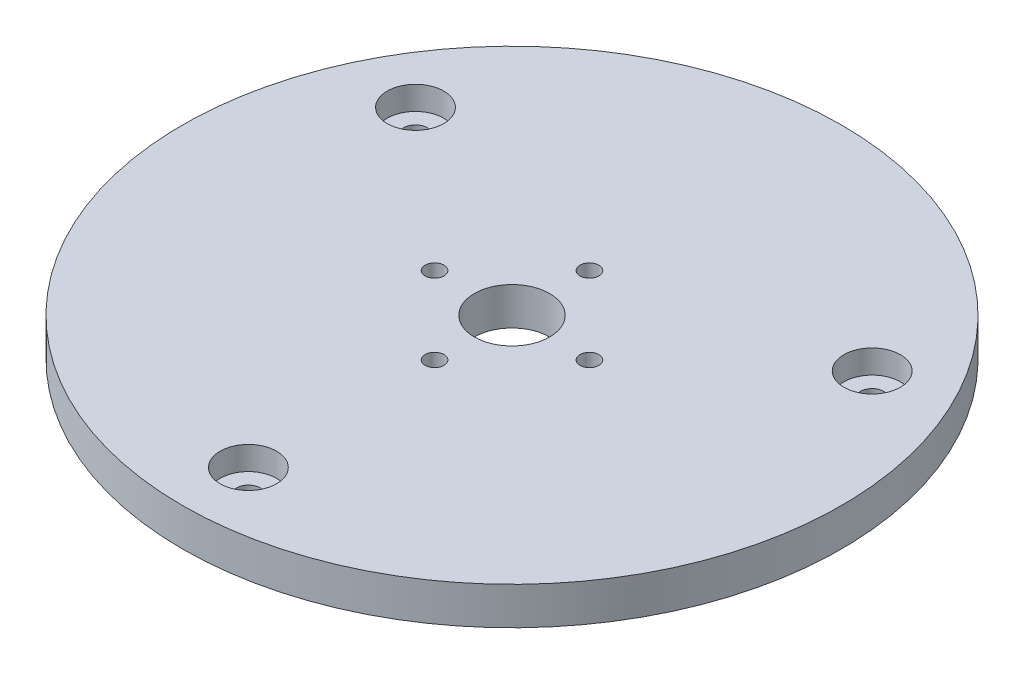
ISO-10303-21;
HEADER;
FILE_DESCRIPTION(('STEP AP214'),'2;1');
FILE_NAME('part.step','',(''),(''),'','','');
FILE_SCHEMA(('AUTOMOTIVE_DESIGN { 1 0 10303 214 1 1 1 1 }'));
ENDSEC;
DATA;
#1=APPLICATION_CONTEXT('core data for automotive mechanical design processes');
#2=APPLICATION_PROTOCOL_DEFINITION('international standard','automotive_design',2000,#1);
#3=PRODUCT_CONTEXT('',#1,'mechanical');
#4=PRODUCT('Part','Part','',(#3));
#5=PRODUCT_RELATED_PRODUCT_CATEGORY('part','',(#4));
#6=PRODUCT_DEFINITION_FORMATION('','',#4);
#7=PRODUCT_DEFINITION_CONTEXT('part definition',#1,'design');
#8=PRODUCT_DEFINITION('design','',#6,#7);
#9=PRODUCT_DEFINITION_SHAPE('','',#8);
#10=(LENGTH_UNIT() NAMED_UNIT(*) SI_UNIT(.MILLI.,.METRE.));
#11=(NAMED_UNIT(*) PLANE_ANGLE_UNIT() SI_UNIT($,.RADIAN.));
#12=(NAMED_UNIT(*) SI_UNIT($,.STERADIAN.) SOLID_ANGLE_UNIT());
#13=UNCERTAINTY_MEASURE_WITH_UNIT(LENGTH_MEASURE(1.E-05),#10,'distance_accuracy_value','');
#14=(GEOMETRIC_REPRESENTATION_CONTEXT(3) GLOBAL_UNCERTAINTY_ASSIGNED_CONTEXT((#13)) GLOBAL_UNIT_ASSIGNED_CONTEXT((#10,
#11,#12)) REPRESENTATION_CONTEXT('',''));
#15=CARTESIAN_POINT('',(0.,0.,0.));
#16=DIRECTION('',(0.,0.,1.));
#17=DIRECTION('',(1.,0.,0.));
#18=AXIS2_PLACEMENT_3D('',#15,#16,#17);
#19=CARTESIAN_POINT('',(0.,0.,-8.2270625170551));
#20=DIRECTION('',(0.,1.,0.));
#21=DIRECTION('',(0.,0.,1.));
#22=AXIS2_PLACEMENT_3D('',#19,#20,#21);
#23=CYLINDRICAL_SURFACE('',#22,1.);
#24=CARTESIAN_POINT('',(0.,4.,-8.2270625170551));
#25=DIRECTION('',(0.,1.,0.));
#26=DIRECTION('',(0.,0.,1.));
#27=AXIS2_PLACEMENT_3D('',#24,#25,#26);
#28=CIRCLE('',#27,1.);
#29=CARTESIAN_POINT('',(0.,4.,-7.2270625170551));
#30=VERTEX_POINT('',#29);
#31=EDGE_CURVE('E52',#30,#30,#28,.T.);
#32=ORIENTED_EDGE('',*,*,#31,.T.);
#33=EDGE_LOOP('',(#32));
#34=FACE_BOUND('',#33,.T.);
#35=CARTESIAN_POINT('',(0.,2.5,-8.2270625170551));
#36=DIRECTION('',(0.,-1.,0.));
#37=DIRECTION('',(0.,0.,-1.));
#38=AXIS2_PLACEMENT_3D('',#35,#36,#37);
#39=CIRCLE('',#38,1.);
#40=CARTESIAN_POINT('',(0.,2.5,-9.2270625170551));
#41=VERTEX_POINT('',#40);
#42=EDGE_CURVE('E41',#41,#41,#39,.F.);
#43=ORIENTED_EDGE('',*,*,#42,.F.);
#44=EDGE_LOOP('',(#43));
#45=FACE_BOUND('',#44,.T.);
#46=ADVANCED_FACE('F37',(#34,#45),#23,.F.);
#47=CARTESIAN_POINT('',(-8.22706251705486,0.,2.33323418036613E-13));
#48=DIRECTION('',(0.,1.,0.));
#49=DIRECTION('',(0.,0.,1.));
#50=AXIS2_PLACEMENT_3D('',#47,#48,#49);
#51=CYLINDRICAL_SURFACE('',#50,1.00000000000037);
#52=CARTESIAN_POINT('',(-8.22706251705486,4.,2.33323418036613E-13));
#53=DIRECTION('',(0.,1.,0.));
#54=DIRECTION('',(0.,0.,1.));
#55=AXIS2_PLACEMENT_3D('',#52,#53,#54);
#56=CIRCLE('',#55,1.00000000000037);
#57=CARTESIAN_POINT('',(-8.22706251705486,4.,1.00000000000061));
#58=VERTEX_POINT('',#57);
#59=EDGE_CURVE('E114',#58,#58,#56,.T.);
#60=ORIENTED_EDGE('',*,*,#59,.T.);
#61=EDGE_LOOP('',(#60));
#62=FACE_BOUND('',#61,.T.);
#63=CARTESIAN_POINT('',(-8.22706251705486,2.5,2.33323418036613E-13));
#64=DIRECTION('',(0.,-1.,0.));
#65=DIRECTION('',(0.,0.,-1.));
#66=AXIS2_PLACEMENT_3D('',#63,#64,#65);
#67=CIRCLE('',#66,1.00000000000037);
#68=CARTESIAN_POINT('',(-8.22706251705486,2.5,-1.00000000000014));
#69=VERTEX_POINT('',#68);
#70=EDGE_CURVE('E79',#69,#69,#67,.F.);
#71=ORIENTED_EDGE('',*,*,#70,.F.);
#72=EDGE_LOOP('',(#71));
#73=FACE_BOUND('',#72,.T.);
#74=ADVANCED_FACE('F160',(#62,#73),#51,.F.);
#75=CARTESIAN_POINT('',(4.64631786917647E-13,0.,8.2270625170551));
#76=DIRECTION('',(0.,1.,0.));
#77=DIRECTION('',(0.,0.,1.));
#78=AXIS2_PLACEMENT_3D('',#75,#76,#77);
#79=CYLINDRICAL_SURFACE('',#78,1.0000000000005);
#80=CARTESIAN_POINT('',(4.64631786917647E-13,4.,8.2270625170551));
#81=DIRECTION('',(0.,1.,0.));
#82=DIRECTION('',(0.,0.,1.));
#83=AXIS2_PLACEMENT_3D('',#80,#81,#82);
#84=CIRCLE('',#83,1.0000000000005);
#85=CARTESIAN_POINT('',(4.64631786917647E-13,4.,9.22706251705559));
#86=VERTEX_POINT('',#85);
#87=EDGE_CURVE('E109',#86,#86,#84,.T.);
#88=ORIENTED_EDGE('',*,*,#87,.T.);
#89=EDGE_LOOP('',(#88));
#90=FACE_BOUND('',#89,.T.);
#91=CARTESIAN_POINT('',(4.64631786917647E-13,2.5,8.2270625170551));
#92=DIRECTION('',(0.,-1.,0.));
#93=DIRECTION('',(0.,0.,-1.));
#94=AXIS2_PLACEMENT_3D('',#91,#92,#93);
#95=CIRCLE('',#94,1.0000000000005);
#96=CARTESIAN_POINT('',(4.64631786917647E-13,2.5,7.2270625170546));
#97=VERTEX_POINT('',#96);
#98=EDGE_CURVE('E75',#97,#97,#95,.F.);
#99=ORIENTED_EDGE('',*,*,#98,.F.);
#100=EDGE_LOOP('',(#99));
#101=FACE_BOUND('',#100,.T.);
#102=ADVANCED_FACE('F166',(#90,#101),#79,.F.);
#103=CARTESIAN_POINT('',(8.22706251705533,0.,-2.32315893458824E-13));
#104=DIRECTION('',(0.,1.,0.));
#105=DIRECTION('',(0.,0.,1.));
#106=AXIS2_PLACEMENT_3D('',#103,#104,#105);
#107=CYLINDRICAL_SURFACE('',#106,1.00000000000018);
#108=CARTESIAN_POINT('',(8.22706251705533,4.,-2.32315893458824E-13));
#109=DIRECTION('',(0.,1.,0.));
#110=DIRECTION('',(0.,0.,1.));
#111=AXIS2_PLACEMENT_3D('',#108,#109,#110);
#112=CIRCLE('',#111,1.00000000000018);
#113=CARTESIAN_POINT('',(8.22706251705533,4.,0.99999999999995));
#114=VERTEX_POINT('',#113);
#115=EDGE_CURVE('E113',#114,#114,#112,.T.);
#116=ORIENTED_EDGE('',*,*,#115,.T.);
#117=EDGE_LOOP('',(#116));
#118=FACE_BOUND('',#117,.T.);
#119=CARTESIAN_POINT('',(8.22706251705533,2.5,-2.32315893458824E-13));
#120=DIRECTION('',(0.,-1.,0.));
#121=DIRECTION('',(0.,0.,-1.));
#122=AXIS2_PLACEMENT_3D('',#119,#120,#121);
#123=CIRCLE('',#122,1.00000000000018);
#124=CARTESIAN_POINT('',(8.22706251705533,2.5,-1.00000000000041));
#125=VERTEX_POINT('',#124);
#126=EDGE_CURVE('E71',#125,#125,#123,.F.);
#127=ORIENTED_EDGE('',*,*,#126,.F.);
#128=EDGE_LOOP('',(#127));
#129=FACE_BOUND('',#128,.T.);
#130=ADVANCED_FACE('F238',(#118,#129),#107,.F.);
#131=CARTESIAN_POINT('',(0.,0.,28.));
#132=DIRECTION('',(0.,1.,0.));
#133=DIRECTION('',(0.,0.,1.));
#134=AXIS2_PLACEMENT_3D('',#131,#132,#133);
#135=CYLINDRICAL_SURFACE('',#134,1.25);
#136=CARTESIAN_POINT('',(0.,0.,28.));
#137=DIRECTION('',(0.,1.,0.));
#138=DIRECTION('',(0.,0.,-1.));
#139=AXIS2_PLACEMENT_3D('',#136,#137,#138);
#140=CIRCLE('',#139,1.25);
#141=CARTESIAN_POINT('',(0.,0.,26.75));
#142=VERTEX_POINT('',#141);
#143=EDGE_CURVE('E119',#142,#142,#140,.T.);
#144=ORIENTED_EDGE('',*,*,#143,.F.);
#145=EDGE_LOOP('',(#144));
#146=FACE_BOUND('',#145,.T.);
#147=CARTESIAN_POINT('',(0.,1.5,28.));
#148=DIRECTION('',(0.,1.,0.));
#149=DIRECTION('',(0.,0.,1.));
#150=AXIS2_PLACEMENT_3D('',#147,#148,#149);
#151=CIRCLE('',#150,1.25);
#152=CARTESIAN_POINT('',(0.,1.5,29.25));
#153=VERTEX_POINT('',#152);
#154=EDGE_CURVE('E66',#153,#153,#151,.F.);
#155=ORIENTED_EDGE('',*,*,#154,.F.);
#156=EDGE_LOOP('',(#155));
#157=FACE_BOUND('',#156,.T.);
#158=ADVANCED_FACE('F341',(#146,#157),#135,.F.);
#159=CARTESIAN_POINT('',(-24.2487113059642,0.,-14.0000000000001));
#160=DIRECTION('',(0.,1.,0.));
#161=DIRECTION('',(0.,0.,1.));
#162=AXIS2_PLACEMENT_3D('',#159,#160,#161);
#163=CYLINDRICAL_SURFACE('',#162,1.25);
#164=CARTESIAN_POINT('',(-24.2487113059642,0.,-14.0000000000001));
#165=DIRECTION('',(0.,1.,0.));
#166=DIRECTION('',(0.,0.,-1.));
#167=AXIS2_PLACEMENT_3D('',#164,#165,#166);
#168=CIRCLE('',#167,1.25);
#169=CARTESIAN_POINT('',(-24.2487113059642,0.,-15.2500000000001));
#170=VERTEX_POINT('',#169);
#171=EDGE_CURVE('E118',#170,#170,#168,.T.);
#172=ORIENTED_EDGE('',*,*,#171,.F.);
#173=EDGE_LOOP('',(#172));
#174=FACE_BOUND('',#173,.T.);
#175=CARTESIAN_POINT('',(-24.2487113059642,1.5,-14.0000000000001));
#176=DIRECTION('',(0.,1.,0.));
#177=DIRECTION('',(0.,0.,1.));
#178=AXIS2_PLACEMENT_3D('',#175,#176,#177);
#179=CIRCLE('',#178,1.25);
#180=CARTESIAN_POINT('',(-24.2487113059642,1.5,-12.7500000000001));
#181=VERTEX_POINT('',#180);
#182=EDGE_CURVE('E61',#181,#181,#179,.F.);
#183=ORIENTED_EDGE('',*,*,#182,.F.);
#184=EDGE_LOOP('',(#183));
#185=FACE_BOUND('',#184,.T.);
#186=ADVANCED_FACE('F138',(#174,#185),#163,.F.);
#187=CARTESIAN_POINT('',(24.2487113059644,0.,-13.9999999999998));
#188=DIRECTION('',(0.,1.,0.));
#189=DIRECTION('',(0.,0.,1.));
#190=AXIS2_PLACEMENT_3D('',#187,#188,#189);
#191=CYLINDRICAL_SURFACE('',#190,1.25);
#192=CARTESIAN_POINT('',(24.2487113059644,0.,-13.9999999999998));
#193=DIRECTION('',(0.,1.,0.));
#194=DIRECTION('',(0.,0.,-1.));
#195=AXIS2_PLACEMENT_3D('',#192,#193,#194);
#196=CIRCLE('',#195,1.25);
#197=CARTESIAN_POINT('',(24.2487113059644,0.,-15.2499999999998));
#198=VERTEX_POINT('',#197);
#199=EDGE_CURVE('E105',#198,#198,#196,.T.);
#200=ORIENTED_EDGE('',*,*,#199,.F.);
#201=EDGE_LOOP('',(#200));
#202=FACE_BOUND('',#201,.T.);
#203=CARTESIAN_POINT('',(24.2487113059644,1.5,-13.9999999999998));
#204=DIRECTION('',(0.,1.,0.));
#205=DIRECTION('',(0.,0.,1.));
#206=AXIS2_PLACEMENT_3D('',#203,#204,#205);
#207=CIRCLE('',#206,1.25);
#208=CARTESIAN_POINT('',(24.2487113059644,1.5,-12.7499999999998));
#209=VERTEX_POINT('',#208);
#210=EDGE_CURVE('E57',#209,#209,#207,.F.);
#211=ORIENTED_EDGE('',*,*,#210,.F.);
#212=EDGE_LOOP('',(#211));
#213=FACE_BOUND('',#212,.T.);
#214=ADVANCED_FACE('F135',(#202,#213),#191,.F.);
#215=CARTESIAN_POINT('',(0.,4.,0.));
#216=DIRECTION('',(0.,-1.,0.));
#217=DIRECTION('',(0.,0.,-1.));
#218=AXIS2_PLACEMENT_3D('',#215,#216,#217);
#219=CYLINDRICAL_SURFACE('',#218,35.);
#220=CARTESIAN_POINT('',(0.,4.,0.));
#221=DIRECTION('',(0.,1.,0.));
#222=DIRECTION('',(0.,0.,1.));
#223=AXIS2_PLACEMENT_3D('',#220,#221,#222);
#224=CIRCLE('',#223,35.);
#225=CARTESIAN_POINT('',(0.,4.,35.));
#226=VERTEX_POINT('',#225);
#227=EDGE_CURVE('E10',#226,#226,#224,.T.);
#228=ORIENTED_EDGE('',*,*,#227,.F.);
#229=EDGE_LOOP('',(#228));
#230=FACE_BOUND('',#229,.T.);
#231=CARTESIAN_POINT('',(0.,0.,0.));
#232=DIRECTION('',(0.,1.,0.));
#233=DIRECTION('',(0.,0.,1.));
#234=AXIS2_PLACEMENT_3D('',#231,#232,#233);
#235=CIRCLE('',#234,35.);
#236=CARTESIAN_POINT('',(0.,0.,35.));
#237=VERTEX_POINT('',#236);
#238=EDGE_CURVE('E46',#237,#237,#235,.T.);
#239=ORIENTED_EDGE('',*,*,#238,.T.);
#240=EDGE_LOOP('',(#239));
#241=FACE_BOUND('',#240,.T.);
#242=ADVANCED_FACE('F39',(#230,#241),#219,.T.);
#243=CARTESIAN_POINT('',(0.,4.,0.));
#244=DIRECTION('',(0.,1.,0.));
#245=DIRECTION('',(0.,0.,1.));
#246=AXIS2_PLACEMENT_3D('',#243,#244,#245);
#247=PLANE('',#246);
#248=CARTESIAN_POINT('',(24.2487113059644,4.,-13.9999999999998));
#249=DIRECTION('',(0.,1.,0.));
#250=DIRECTION('',(0.,0.,1.));
#251=AXIS2_PLACEMENT_3D('',#248,#249,#250);
#252=CIRCLE('',#251,3.);
#253=CARTESIAN_POINT('',(24.2487113059644,4.,-10.9999999999998));
#254=VERTEX_POINT('',#253);
#255=EDGE_CURVE('E209',#254,#254,#252,.T.);
#256=ORIENTED_EDGE('',*,*,#255,.F.);
#257=EDGE_LOOP('',(#256));
#258=FACE_BOUND('',#257,.T.);
#259=CARTESIAN_POINT('',(1.50620894495059E-12,4.,28.000000000001));
#260=DIRECTION('',(0.,1.,0.));
#261=DIRECTION('',(0.,0.,1.));
#262=AXIS2_PLACEMENT_3D('',#259,#260,#261);
#263=CIRCLE('',#262,2.99999999999943);
#264=CARTESIAN_POINT('',(1.50620894495059E-12,4.,31.0000000000005));
#265=VERTEX_POINT('',#264);
#266=EDGE_CURVE('E97',#265,#265,#263,.T.);
#267=ORIENTED_EDGE('',*,*,#266,.F.);
#268=EDGE_LOOP('',(#267));
#269=FACE_BOUND('',#268,.T.);
#270=CARTESIAN_POINT('',(-24.2487113059642,4.,-13.9999999999982));
#271=DIRECTION('',(0.,1.,0.));
#272=DIRECTION('',(0.,0.,1.));
#273=AXIS2_PLACEMENT_3D('',#270,#271,#272);
#274=CIRCLE('',#273,3.00000000000145);
#275=CARTESIAN_POINT('',(-24.2487113059642,4.,-10.9999999999967));
#276=VERTEX_POINT('',#275);
#277=EDGE_CURVE('E86',#276,#276,#274,.T.);
#278=ORIENTED_EDGE('',*,*,#277,.F.);
#279=EDGE_LOOP('',(#278));
#280=FACE_BOUND('',#279,.T.);
#281=CARTESIAN_POINT('',(0.,4.,0.));
#282=DIRECTION('',(0.,1.,0.));
#283=DIRECTION('',(0.,0.,1.));
#284=AXIS2_PLACEMENT_3D('',#281,#282,#283);
#285=CIRCLE('',#284,4.);
#286=CARTESIAN_POINT('',(0.,4.,4.));
#287=VERTEX_POINT('',#286);
#288=EDGE_CURVE('E70',#287,#287,#285,.F.);
#289=ORIENTED_EDGE('',*,*,#288,.T.);
#290=EDGE_LOOP('',(#289));
#291=FACE_BOUND('',#290,.T.);
#292=ORIENTED_EDGE('',*,*,#115,.F.);
#293=EDGE_LOOP('',(#292));
#294=FACE_BOUND('',#293,.T.);
#295=ORIENTED_EDGE('',*,*,#87,.F.);
#296=EDGE_LOOP('',(#295));
#297=FACE_BOUND('',#296,.T.);
#298=ORIENTED_EDGE('',*,*,#59,.F.);
#299=EDGE_LOOP('',(#298));
#300=FACE_BOUND('',#299,.T.);
#301=ORIENTED_EDGE('',*,*,#31,.F.);
#302=EDGE_LOOP('',(#301));
#303=FACE_BOUND('',#302,.T.);
#304=ORIENTED_EDGE('',*,*,#227,.T.);
#305=EDGE_LOOP('',(#304));
#306=FACE_BOUND('',#305,.T.);
#307=ADVANCED_FACE('F173',(#258,#269,#280,#291,#294,#297,#300,#303,#306),#247,.T.);
#308=CARTESIAN_POINT('',(0.,0.,0.));
#309=DIRECTION('',(0.,1.,0.));
#310=DIRECTION('',(0.,0.,1.));
#311=AXIS2_PLACEMENT_3D('',#308,#309,#310);
#312=PLANE('',#311);
#313=CARTESIAN_POINT('',(4.64631786917647E-13,0.,8.2270625170551));
#314=DIRECTION('',(0.,-1.,0.));
#315=DIRECTION('',(0.,0.,-1.));
#316=AXIS2_PLACEMENT_3D('',#313,#314,#315);
#317=CIRCLE('',#316,2.);
#318=CARTESIAN_POINT('',(4.64631786917647E-13,0.,6.2270625170551));
#319=VERTEX_POINT('',#318);
#320=EDGE_CURVE('E183',#319,#319,#317,.T.);
#321=ORIENTED_EDGE('',*,*,#320,.F.);
#322=EDGE_LOOP('',(#321));
#323=FACE_BOUND('',#322,.T.);
#324=CARTESIAN_POINT('',(8.22706251705533,0.,-2.35338467192193E-13));
#325=DIRECTION('',(0.,-1.,0.));
#326=DIRECTION('',(0.,0.,-1.));
#327=AXIS2_PLACEMENT_3D('',#324,#325,#326);
#328=CIRCLE('',#327,2.00000000000018);
#329=CARTESIAN_POINT('',(8.22706251705533,0.,-2.00000000000041));
#330=VERTEX_POINT('',#329);
#331=EDGE_CURVE('E187',#330,#330,#328,.T.);
#332=ORIENTED_EDGE('',*,*,#331,.F.);
#333=EDGE_LOOP('',(#332));
#334=FACE_BOUND('',#333,.T.);
#335=CARTESIAN_POINT('',(0.,0.,-8.2270625170551));
#336=DIRECTION('',(0.,-1.,0.));
#337=DIRECTION('',(0.,0.,-1.));
#338=AXIS2_PLACEMENT_3D('',#335,#336,#337);
#339=CIRCLE('',#338,2.00000000000049);
#340=CARTESIAN_POINT('',(0.,0.,-10.2270625170556));
#341=VERTEX_POINT('',#340);
#342=EDGE_CURVE('E191',#341,#341,#339,.T.);
#343=ORIENTED_EDGE('',*,*,#342,.F.);
#344=EDGE_LOOP('',(#343));
#345=FACE_BOUND('',#344,.T.);
#346=CARTESIAN_POINT('',(-8.22706251705487,0.,2.34330942614403E-13));
#347=DIRECTION('',(0.,-1.,0.));
#348=DIRECTION('',(0.,0.,-1.));
#349=AXIS2_PLACEMENT_3D('',#346,#347,#348);
#350=CIRCLE('',#349,2.00000000000037);
#351=CARTESIAN_POINT('',(-8.22706251705487,0.,-2.00000000000014));
#352=VERTEX_POINT('',#351);
#353=EDGE_CURVE('E195',#352,#352,#350,.T.);
#354=ORIENTED_EDGE('',*,*,#353,.F.);
#355=EDGE_LOOP('',(#354));
#356=FACE_BOUND('',#355,.T.);
#357=CARTESIAN_POINT('',(0.,0.,0.));
#358=DIRECTION('',(0.,-1.,0.));
#359=DIRECTION('',(0.,0.,-1.));
#360=AXIS2_PLACEMENT_3D('',#357,#358,#359);
#361=CIRCLE('',#360,4.);
#362=CARTESIAN_POINT('',(0.,0.,-4.));
#363=VERTEX_POINT('',#362);
#364=EDGE_CURVE('E101',#363,#363,#361,.T.);
#365=ORIENTED_EDGE('',*,*,#364,.F.);
#366=EDGE_LOOP('',(#365));
#367=FACE_BOUND('',#366,.T.);
#368=ORIENTED_EDGE('',*,*,#199,.T.);
#369=EDGE_LOOP('',(#368));
#370=FACE_BOUND('',#369,.T.);
#371=ORIENTED_EDGE('',*,*,#171,.T.);
#372=EDGE_LOOP('',(#371));
#373=FACE_BOUND('',#372,.T.);
#374=ORIENTED_EDGE('',*,*,#143,.T.);
#375=EDGE_LOOP('',(#374));
#376=FACE_BOUND('',#375,.T.);
#377=ORIENTED_EDGE('',*,*,#238,.F.);
#378=EDGE_LOOP('',(#377));
#379=FACE_BOUND('',#378,.T.);
#380=ADVANCED_FACE('F132',(#323,#334,#345,#356,#367,#370,#373,#376,#379),#312,.F.);
#381=CARTESIAN_POINT('',(0.,4.001,0.));
#382=DIRECTION('',(0.,-1.,0.));
#383=DIRECTION('',(0.,0.,-1.));
#384=AXIS2_PLACEMENT_3D('',#381,#382,#383);
#385=CYLINDRICAL_SURFACE('',#384,4.);
#386=ORIENTED_EDGE('',*,*,#288,.F.);
#387=EDGE_LOOP('',(#386));
#388=FACE_BOUND('',#387,.T.);
#389=ORIENTED_EDGE('',*,*,#364,.T.);
#390=EDGE_LOOP('',(#389));
#391=FACE_BOUND('',#390,.T.);
#392=ADVANCED_FACE('F145',(#388,#391),#385,.F.);
#393=CARTESIAN_POINT('',(24.2487113059644,1.5,-13.9999999999998));
#394=DIRECTION('',(0.,1.,0.));
#395=DIRECTION('',(0.,0.,1.));
#396=AXIS2_PLACEMENT_3D('',#393,#394,#395);
#397=PLANE('',#396);
#398=CARTESIAN_POINT('',(24.2487113059644,1.5,-13.9999999999998));
#399=DIRECTION('',(0.,1.,0.));
#400=DIRECTION('',(0.,0.,1.));
#401=AXIS2_PLACEMENT_3D('',#398,#399,#400);
#402=CIRCLE('',#401,3.);
#403=CARTESIAN_POINT('',(24.2487113059644,1.5,-10.9999999999998));
#404=VERTEX_POINT('',#403);
#405=EDGE_CURVE('E62',#404,#404,#402,.T.);
#406=ORIENTED_EDGE('',*,*,#405,.T.);
#407=EDGE_LOOP('',(#406));
#408=FACE_BOUND('',#407,.T.);
#409=ORIENTED_EDGE('',*,*,#210,.T.);
#410=EDGE_LOOP('',(#409));
#411=FACE_BOUND('',#410,.T.);
#412=ADVANCED_FACE('F142',(#408,#411),#397,.T.);
#413=CARTESIAN_POINT('',(24.2487113059644,1.5,-13.9999999999998));
#414=DIRECTION('',(0.,1.,0.));
#415=DIRECTION('',(0.,0.,1.));
#416=AXIS2_PLACEMENT_3D('',#413,#414,#415);
#417=CYLINDRICAL_SURFACE('',#416,3.);
#418=ORIENTED_EDGE('',*,*,#405,.F.);
#419=EDGE_LOOP('',(#418));
#420=FACE_BOUND('',#419,.T.);
#421=ORIENTED_EDGE('',*,*,#255,.T.);
#422=EDGE_LOOP('',(#421));
#423=FACE_BOUND('',#422,.T.);
#424=ADVANCED_FACE('F144',(#420,#423),#417,.F.);
#425=CARTESIAN_POINT('',(-24.2487113059642,1.5,-13.9999999999982));
#426=DIRECTION('',(0.,1.,0.));
#427=DIRECTION('',(0.,0.,1.));
#428=AXIS2_PLACEMENT_3D('',#425,#426,#427);
#429=PLANE('',#428);
#430=CARTESIAN_POINT('',(-24.2487113059642,1.5,-13.9999999999982));
#431=DIRECTION('',(0.,1.,0.));
#432=DIRECTION('',(0.,0.,1.));
#433=AXIS2_PLACEMENT_3D('',#430,#431,#432);
#434=CIRCLE('',#433,3.00000000000145);
#435=CARTESIAN_POINT('',(-24.2487113059642,1.5,-10.9999999999967));
#436=VERTEX_POINT('',#435);
#437=EDGE_CURVE('E91',#436,#436,#434,.T.);
#438=ORIENTED_EDGE('',*,*,#437,.T.);
#439=EDGE_LOOP('',(#438));
#440=FACE_BOUND('',#439,.T.);
#441=ORIENTED_EDGE('',*,*,#182,.T.);
#442=EDGE_LOOP('',(#441));
#443=FACE_BOUND('',#442,.T.);
#444=ADVANCED_FACE('F152',(#440,#443),#429,.T.);
#445=CARTESIAN_POINT('',(-24.2487113059642,1.5,-13.9999999999982));
#446=DIRECTION('',(0.,1.,0.));
#447=DIRECTION('',(0.,0.,1.));
#448=AXIS2_PLACEMENT_3D('',#445,#446,#447);
#449=CYLINDRICAL_SURFACE('',#448,3.00000000000145);
#450=ORIENTED_EDGE('',*,*,#437,.F.);
#451=EDGE_LOOP('',(#450));
#452=FACE_BOUND('',#451,.T.);
#453=ORIENTED_EDGE('',*,*,#277,.T.);
#454=EDGE_LOOP('',(#453));
#455=FACE_BOUND('',#454,.T.);
#456=ADVANCED_FACE('F358',(#452,#455),#449,.F.);
#457=CARTESIAN_POINT('',(1.50620894495059E-12,1.5,28.000000000001));
#458=DIRECTION('',(0.,1.,0.));
#459=DIRECTION('',(0.,0.,1.));
#460=AXIS2_PLACEMENT_3D('',#457,#458,#459);
#461=PLANE('',#460);
#462=CARTESIAN_POINT('',(1.50620894495059E-12,1.5,28.000000000001));
#463=DIRECTION('',(0.,1.,0.));
#464=DIRECTION('',(0.,0.,1.));
#465=AXIS2_PLACEMENT_3D('',#462,#463,#464);
#466=CIRCLE('',#465,2.99999999999943);
#467=CARTESIAN_POINT('',(1.50620894495059E-12,1.5,31.0000000000005));
#468=VERTEX_POINT('',#467);
#469=EDGE_CURVE('E213',#468,#468,#466,.T.);
#470=ORIENTED_EDGE('',*,*,#469,.T.);
#471=EDGE_LOOP('',(#470));
#472=FACE_BOUND('',#471,.T.);
#473=ORIENTED_EDGE('',*,*,#154,.T.);
#474=EDGE_LOOP('',(#473));
#475=FACE_BOUND('',#474,.T.);
#476=ADVANCED_FACE('F349',(#472,#475),#461,.T.);
#477=CARTESIAN_POINT('',(1.50620894495059E-12,1.5,28.000000000001));
#478=DIRECTION('',(0.,1.,0.));
#479=DIRECTION('',(0.,0.,1.));
#480=AXIS2_PLACEMENT_3D('',#477,#478,#479);
#481=CYLINDRICAL_SURFACE('',#480,2.99999999999943);
#482=ORIENTED_EDGE('',*,*,#469,.F.);
#483=EDGE_LOOP('',(#482));
#484=FACE_BOUND('',#483,.T.);
#485=ORIENTED_EDGE('',*,*,#266,.T.);
#486=EDGE_LOOP('',(#485));
#487=FACE_BOUND('',#486,.T.);
#488=ADVANCED_FACE('F220',(#484,#487),#481,.F.);
#489=CARTESIAN_POINT('',(8.22706251705533,2.5,-2.35338467192193E-13));
#490=DIRECTION('',(0.,-1.,0.));
#491=DIRECTION('',(0.,0.,-1.));
#492=AXIS2_PLACEMENT_3D('',#489,#490,#491);
#493=PLANE('',#492);
#494=CARTESIAN_POINT('',(8.22706251705533,2.5,-2.35338467192193E-13));
#495=DIRECTION('',(0.,-1.,0.));
#496=DIRECTION('',(0.,0.,-1.));
#497=AXIS2_PLACEMENT_3D('',#494,#495,#496);
#498=CIRCLE('',#497,2.00000000000018);
#499=CARTESIAN_POINT('',(8.22706251705533,2.5,-2.00000000000041));
#500=VERTEX_POINT('',#499);
#501=EDGE_CURVE('E471',#500,#500,#498,.T.);
#502=ORIENTED_EDGE('',*,*,#501,.T.);
#503=EDGE_LOOP('',(#502));
#504=FACE_BOUND('',#503,.T.);
#505=ORIENTED_EDGE('',*,*,#126,.T.);
#506=EDGE_LOOP('',(#505));
#507=FACE_BOUND('',#506,.T.);
#508=ADVANCED_FACE('F255',(#504,#507),#493,.T.);
#509=CARTESIAN_POINT('',(8.22706251705533,2.5,-2.35338467192193E-13));
#510=DIRECTION('',(0.,-1.,0.));
#511=DIRECTION('',(0.,0.,-1.));
#512=AXIS2_PLACEMENT_3D('',#509,#510,#511);
#513=CYLINDRICAL_SURFACE('',#512,2.00000000000018);
#514=ORIENTED_EDGE('',*,*,#501,.F.);
#515=EDGE_LOOP('',(#514));
#516=FACE_BOUND('',#515,.T.);
#517=ORIENTED_EDGE('',*,*,#331,.T.);
#518=EDGE_LOOP('',(#517));
#519=FACE_BOUND('',#518,.T.);
#520=ADVANCED_FACE('F245',(#516,#519),#513,.F.);
#521=CARTESIAN_POINT('',(4.64631786917647E-13,2.5,8.2270625170551));
#522=DIRECTION('',(0.,-1.,0.));
#523=DIRECTION('',(0.,0.,-1.));
#524=AXIS2_PLACEMENT_3D('',#521,#522,#523);
#525=PLANE('',#524);
#526=CARTESIAN_POINT('',(4.64631786917647E-13,2.5,8.2270625170551));
#527=DIRECTION('',(0.,-1.,0.));
#528=DIRECTION('',(0.,0.,-1.));
#529=AXIS2_PLACEMENT_3D('',#526,#527,#528);
#530=CIRCLE('',#529,2.);
#531=CARTESIAN_POINT('',(4.64631786917647E-13,2.5,6.2270625170551));
#532=VERTEX_POINT('',#531);
#533=EDGE_CURVE('E76',#532,#532,#530,.T.);
#534=ORIENTED_EDGE('',*,*,#533,.T.);
#535=EDGE_LOOP('',(#534));
#536=FACE_BOUND('',#535,.T.);
#537=ORIENTED_EDGE('',*,*,#98,.T.);
#538=EDGE_LOOP('',(#537));
#539=FACE_BOUND('',#538,.T.);
#540=ADVANCED_FACE('F242',(#536,#539),#525,.T.);
#541=CARTESIAN_POINT('',(4.64631786917647E-13,2.5,8.2270625170551));
#542=DIRECTION('',(0.,-1.,0.));
#543=DIRECTION('',(0.,0.,-1.));
#544=AXIS2_PLACEMENT_3D('',#541,#542,#543);
#545=CYLINDRICAL_SURFACE('',#544,2.);
#546=ORIENTED_EDGE('',*,*,#533,.F.);
#547=EDGE_LOOP('',(#546));
#548=FACE_BOUND('',#547,.T.);
#549=ORIENTED_EDGE('',*,*,#320,.T.);
#550=EDGE_LOOP('',(#549));
#551=FACE_BOUND('',#550,.T.);
#552=ADVANCED_FACE('F244',(#548,#551),#545,.F.);
#553=CARTESIAN_POINT('',(-8.22706251705487,2.5,2.34330942614403E-13));
#554=DIRECTION('',(0.,-1.,0.));
#555=DIRECTION('',(0.,0.,-1.));
#556=AXIS2_PLACEMENT_3D('',#553,#554,#555);
#557=PLANE('',#556);
#558=CARTESIAN_POINT('',(-8.22706251705487,2.5,2.34330942614403E-13));
#559=DIRECTION('',(0.,-1.,0.));
#560=DIRECTION('',(0.,0.,-1.));
#561=AXIS2_PLACEMENT_3D('',#558,#559,#560);
#562=CIRCLE('',#561,2.00000000000037);
#563=CARTESIAN_POINT('',(-8.22706251705487,2.5,-2.00000000000014));
#564=VERTEX_POINT('',#563);
#565=EDGE_CURVE('E200',#564,#564,#562,.T.);
#566=ORIENTED_EDGE('',*,*,#565,.T.);
#567=EDGE_LOOP('',(#566));
#568=FACE_BOUND('',#567,.T.);
#569=ORIENTED_EDGE('',*,*,#70,.T.);
#570=EDGE_LOOP('',(#569));
#571=FACE_BOUND('',#570,.T.);
#572=ADVANCED_FACE('F252',(#568,#571),#557,.T.);
#573=CARTESIAN_POINT('',(-8.22706251705487,2.5,2.34330942614403E-13));
#574=DIRECTION('',(0.,-1.,0.));
#575=DIRECTION('',(0.,0.,-1.));
#576=AXIS2_PLACEMENT_3D('',#573,#574,#575);
#577=CYLINDRICAL_SURFACE('',#576,2.00000000000037);
#578=ORIENTED_EDGE('',*,*,#565,.F.);
#579=EDGE_LOOP('',(#578));
#580=FACE_BOUND('',#579,.T.);
#581=ORIENTED_EDGE('',*,*,#353,.T.);
#582=EDGE_LOOP('',(#581));
#583=FACE_BOUND('',#582,.T.);
#584=ADVANCED_FACE('F267',(#580,#583),#577,.F.);
#585=CARTESIAN_POINT('',(0.,2.5,-8.2270625170551));
#586=DIRECTION('',(0.,-1.,0.));
#587=DIRECTION('',(0.,0.,-1.));
#588=AXIS2_PLACEMENT_3D('',#585,#586,#587);
#589=PLANE('',#588);
#590=CARTESIAN_POINT('',(0.,2.5,-8.2270625170551));
#591=DIRECTION('',(0.,-1.,0.));
#592=DIRECTION('',(0.,0.,-1.));
#593=AXIS2_PLACEMENT_3D('',#590,#591,#592);
#594=CIRCLE('',#593,2.00000000000049);
#595=CARTESIAN_POINT('',(0.,2.5,-10.2270625170556));
#596=VERTEX_POINT('',#595);
#597=EDGE_CURVE('E464',#596,#596,#594,.T.);
#598=ORIENTED_EDGE('',*,*,#597,.T.);
#599=EDGE_LOOP('',(#598));
#600=FACE_BOUND('',#599,.T.);
#601=ORIENTED_EDGE('',*,*,#42,.T.);
#602=EDGE_LOOP('',(#601));
#603=FACE_BOUND('',#602,.T.);
#604=ADVANCED_FACE('F263',(#600,#603),#589,.T.);
#605=CARTESIAN_POINT('',(0.,2.5,-8.2270625170551));
#606=DIRECTION('',(0.,-1.,0.));
#607=DIRECTION('',(0.,0.,-1.));
#608=AXIS2_PLACEMENT_3D('',#605,#606,#607);
#609=CYLINDRICAL_SURFACE('',#608,2.00000000000049);
#610=ORIENTED_EDGE('',*,*,#597,.F.);
#611=EDGE_LOOP('',(#610));
#612=FACE_BOUND('',#611,.T.);
#613=ORIENTED_EDGE('',*,*,#342,.T.);
#614=EDGE_LOOP('',(#613));
#615=FACE_BOUND('',#614,.T.);
#616=ADVANCED_FACE('F266',(#612,#615),#609,.F.);
#617=CLOSED_SHELL('',(#46,#74,#102,#130,#158,#186,#214,#242,#307,#380,#392,#412,#424,#444,#456,
#476,#488,#508,#520,#540,#552,#572,#584,#604,#616));
#618=MANIFOLD_SOLID_BREP('B2',#617);
#619=ADVANCED_BREP_SHAPE_REPRESENTATION('',(#18,#618),#14);
#620=SHAPE_DEFINITION_REPRESENTATION(#9,#619);
ENDSEC;
END-ISO-10303-21;
